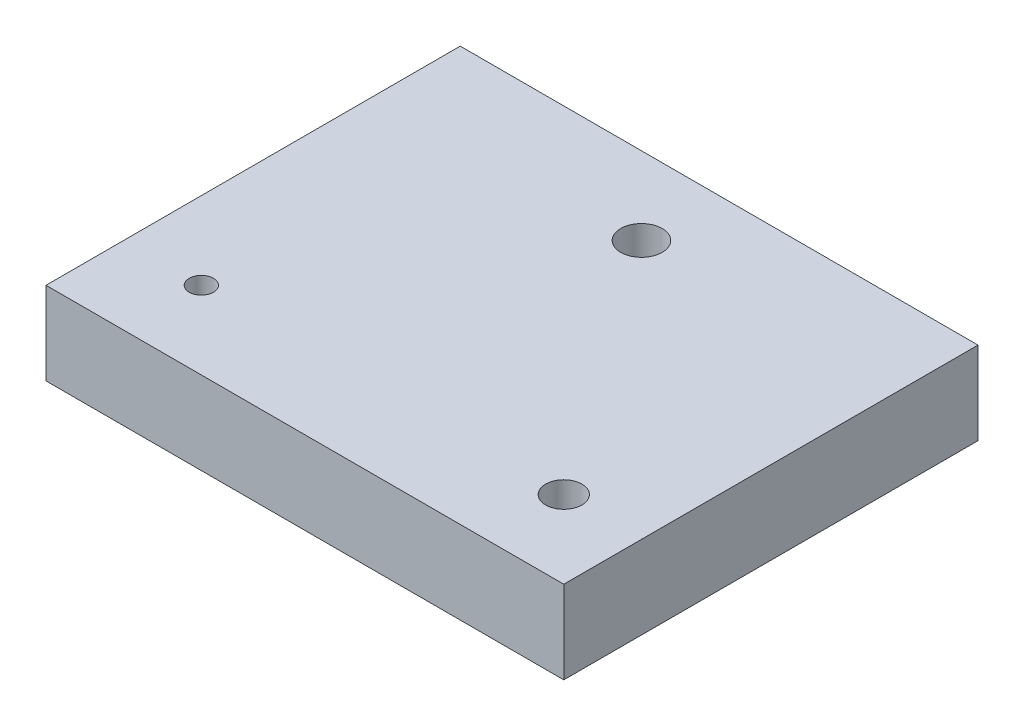
ISO-10303-21;
HEADER;
FILE_DESCRIPTION(('STEP AP214'),'2;1');
FILE_NAME('part.step','',(''),(''),'','','');
FILE_SCHEMA(('AUTOMOTIVE_DESIGN { 1 0 10303 214 1 1 1 1 }'));
ENDSEC;
DATA;
#1=APPLICATION_CONTEXT('core data for automotive mechanical design processes');
#2=APPLICATION_PROTOCOL_DEFINITION('international standard','automotive_design',2000,#1);
#3=PRODUCT_CONTEXT('',#1,'mechanical');
#4=PRODUCT('Part','Part','',(#3));
#5=PRODUCT_RELATED_PRODUCT_CATEGORY('part','',(#4));
#6=PRODUCT_DEFINITION_FORMATION('','',#4);
#7=PRODUCT_DEFINITION_CONTEXT('part definition',#1,'design');
#8=PRODUCT_DEFINITION('design','',#6,#7);
#9=PRODUCT_DEFINITION_SHAPE('','',#8);
#10=(LENGTH_UNIT() NAMED_UNIT(*) SI_UNIT(.MILLI.,.METRE.));
#11=(NAMED_UNIT(*) PLANE_ANGLE_UNIT() SI_UNIT($,.RADIAN.));
#12=(NAMED_UNIT(*) SI_UNIT($,.STERADIAN.) SOLID_ANGLE_UNIT());
#13=UNCERTAINTY_MEASURE_WITH_UNIT(LENGTH_MEASURE(1.E-05),#10,'distance_accuracy_value','');
#14=(GEOMETRIC_REPRESENTATION_CONTEXT(3) GLOBAL_UNCERTAINTY_ASSIGNED_CONTEXT((#13)) GLOBAL_UNIT_ASSIGNED_CONTEXT((#10,
#11,#12)) REPRESENTATION_CONTEXT('',''));
#15=CARTESIAN_POINT('',(0.,0.,0.));
#16=DIRECTION('',(0.,0.,1.));
#17=DIRECTION('',(1.,0.,0.));
#18=AXIS2_PLACEMENT_3D('',#15,#16,#17);
#19=CARTESIAN_POINT('',(0.,16.,0.));
#20=DIRECTION('',(0.,-1.,0.));
#21=DIRECTION('',(0.,0.,-1.));
#22=AXIS2_PLACEMENT_3D('',#19,#20,#21);
#23=PLANE('',#22);
#24=DIRECTION('',(0.,0.,-1.));
#25=VECTOR('',#24,1.);
#26=CARTESIAN_POINT('',(50.,16.,40.));
#27=LINE('',#26,#25);
#28=CARTESIAN_POINT('',(50.,16.,40.));
#29=VERTEX_POINT('',#28);
#30=CARTESIAN_POINT('',(50.,16.,-40.));
#31=VERTEX_POINT('',#30);
#32=EDGE_CURVE('E89',#29,#31,#27,.T.);
#33=ORIENTED_EDGE('',*,*,#32,.T.);
#34=DIRECTION('',(-1.,0.,0.));
#35=VECTOR('',#34,1.);
#36=CARTESIAN_POINT('',(-50.,16.,-40.));
#37=LINE('',#36,#35);
#38=CARTESIAN_POINT('',(-50.,16.,-40.));
#39=VERTEX_POINT('',#38);
#40=EDGE_CURVE('E84',#31,#39,#37,.T.);
#41=ORIENTED_EDGE('',*,*,#40,.T.);
#42=DIRECTION('',(0.,0.,1.));
#43=VECTOR('',#42,1.);
#44=CARTESIAN_POINT('',(-50.,16.,40.));
#45=LINE('',#44,#43);
#46=CARTESIAN_POINT('',(-50.,16.,40.));
#47=VERTEX_POINT('',#46);
#48=EDGE_CURVE('E87',#39,#47,#45,.T.);
#49=ORIENTED_EDGE('',*,*,#48,.T.);
#50=DIRECTION('',(1.,0.,0.));
#51=VECTOR('',#50,1.);
#52=CARTESIAN_POINT('',(-50.,16.,40.));
#53=LINE('',#52,#51);
#54=EDGE_CURVE('E54',#47,#29,#53,.T.);
#55=ORIENTED_EDGE('',*,*,#54,.T.);
#56=EDGE_LOOP('',(#33,#41,#49,#55));
#57=FACE_BOUND('',#56,.T.);
#58=CARTESIAN_POINT('',(-35.,16.,25.));
#59=DIRECTION('',(0.,1.,0.));
#60=DIRECTION('',(0.,0.,1.));
#61=AXIS2_PLACEMENT_3D('',#58,#59,#60);
#62=CIRCLE('',#61,2.3426064283291);
#63=CARTESIAN_POINT('',(-35.,16.,27.3426064283291));
#64=VERTEX_POINT('',#63);
#65=EDGE_CURVE('E104',#64,#64,#62,.T.);
#66=ORIENTED_EDGE('',*,*,#65,.F.);
#67=EDGE_LOOP('',(#66));
#68=FACE_BOUND('',#67,.T.);
#69=CARTESIAN_POINT('',(35.,16.,25.));
#70=DIRECTION('',(0.,1.,0.));
#71=DIRECTION('',(0.,0.,1.));
#72=AXIS2_PLACEMENT_3D('',#69,#70,#71);
#73=CIRCLE('',#72,3.5);
#74=CARTESIAN_POINT('',(35.,16.,28.5));
#75=VERTEX_POINT('',#74);
#76=EDGE_CURVE('E119',#75,#75,#73,.T.);
#77=ORIENTED_EDGE('',*,*,#76,.F.);
#78=EDGE_LOOP('',(#77));
#79=FACE_BOUND('',#78,.T.);
#80=CARTESIAN_POINT('',(0.,16.,-25.));
#81=DIRECTION('',(0.,1.,0.));
#82=DIRECTION('',(0.,0.,1.));
#83=AXIS2_PLACEMENT_3D('',#80,#81,#82);
#84=CIRCLE('',#83,4.);
#85=CARTESIAN_POINT('',(0.,16.,-21.));
#86=VERTEX_POINT('',#85);
#87=EDGE_CURVE('E125',#86,#86,#84,.T.);
#88=ORIENTED_EDGE('',*,*,#87,.F.);
#89=EDGE_LOOP('',(#88));
#90=FACE_BOUND('',#89,.T.);
#91=ADVANCED_FACE('F37',(#57,#68,#79,#90),#23,.F.);
#92=CARTESIAN_POINT('',(0.,0.,0.));
#93=DIRECTION('',(0.,-1.,0.));
#94=DIRECTION('',(0.,0.,-1.));
#95=AXIS2_PLACEMENT_3D('',#92,#93,#94);
#96=PLANE('',#95);
#97=CARTESIAN_POINT('',(35.,0.,25.));
#98=DIRECTION('',(0.,1.,0.));
#99=DIRECTION('',(0.,0.,1.));
#100=AXIS2_PLACEMENT_3D('',#97,#98,#99);
#101=CIRCLE('',#100,3.5);
#102=CARTESIAN_POINT('',(35.,0.,28.5));
#103=VERTEX_POINT('',#102);
#104=EDGE_CURVE('E122',#103,#103,#101,.T.);
#105=ORIENTED_EDGE('',*,*,#104,.T.);
#106=EDGE_LOOP('',(#105));
#107=FACE_BOUND('',#106,.T.);
#108=DIRECTION('',(0.,0.,-1.));
#109=VECTOR('',#108,1.);
#110=CARTESIAN_POINT('',(50.,0.,40.));
#111=LINE('',#110,#109);
#112=CARTESIAN_POINT('',(50.,0.,40.));
#113=VERTEX_POINT('',#112);
#114=CARTESIAN_POINT('',(50.,0.,-40.));
#115=VERTEX_POINT('',#114);
#116=EDGE_CURVE('E101',#113,#115,#111,.T.);
#117=ORIENTED_EDGE('',*,*,#116,.F.);
#118=DIRECTION('',(1.,0.,0.));
#119=VECTOR('',#118,1.);
#120=CARTESIAN_POINT('',(-50.,0.,40.));
#121=LINE('',#120,#119);
#122=CARTESIAN_POINT('',(-50.,0.,40.));
#123=VERTEX_POINT('',#122);
#124=EDGE_CURVE('E77',#123,#113,#121,.T.);
#125=ORIENTED_EDGE('',*,*,#124,.F.);
#126=DIRECTION('',(0.,0.,1.));
#127=VECTOR('',#126,1.);
#128=CARTESIAN_POINT('',(-50.,0.,40.));
#129=LINE('',#128,#127);
#130=CARTESIAN_POINT('',(-50.,0.,-40.));
#131=VERTEX_POINT('',#130);
#132=EDGE_CURVE('E71',#131,#123,#129,.T.);
#133=ORIENTED_EDGE('',*,*,#132,.F.);
#134=DIRECTION('',(-1.,0.,0.));
#135=VECTOR('',#134,1.);
#136=CARTESIAN_POINT('',(-50.,0.,-40.));
#137=LINE('',#136,#135);
#138=EDGE_CURVE('E93',#115,#131,#137,.T.);
#139=ORIENTED_EDGE('',*,*,#138,.F.);
#140=EDGE_LOOP('',(#117,#125,#133,#139));
#141=FACE_BOUND('',#140,.T.);
#142=CARTESIAN_POINT('',(-35.,0.,25.));
#143=DIRECTION('',(0.,1.,0.));
#144=DIRECTION('',(0.,0.,1.));
#145=AXIS2_PLACEMENT_3D('',#142,#143,#144);
#146=CIRCLE('',#145,2.3426064283291);
#147=CARTESIAN_POINT('',(-35.,0.,27.3426064283291));
#148=VERTEX_POINT('',#147);
#149=EDGE_CURVE('E116',#148,#148,#146,.T.);
#150=ORIENTED_EDGE('',*,*,#149,.T.);
#151=EDGE_LOOP('',(#150));
#152=FACE_BOUND('',#151,.T.);
#153=CARTESIAN_POINT('',(0.,0.,-25.));
#154=DIRECTION('',(0.,1.,0.));
#155=DIRECTION('',(0.,0.,1.));
#156=AXIS2_PLACEMENT_3D('',#153,#154,#155);
#157=CIRCLE('',#156,4.);
#158=CARTESIAN_POINT('',(0.,0.,-21.));
#159=VERTEX_POINT('',#158);
#160=EDGE_CURVE('E128',#159,#159,#157,.T.);
#161=ORIENTED_EDGE('',*,*,#160,.T.);
#162=EDGE_LOOP('',(#161));
#163=FACE_BOUND('',#162,.T.);
#164=ADVANCED_FACE('F112',(#107,#141,#152,#163),#96,.T.);
#165=CARTESIAN_POINT('',(50.,16.,40.));
#166=DIRECTION('',(-1.,0.,0.));
#167=DIRECTION('',(0.,0.,1.));
#168=AXIS2_PLACEMENT_3D('',#165,#166,#167);
#169=PLANE('',#168);
#170=ORIENTED_EDGE('',*,*,#116,.T.);
#171=DIRECTION('',(0.,-1.,0.));
#172=VECTOR('',#171,1.);
#173=CARTESIAN_POINT('',(50.,16.,-40.));
#174=LINE('',#173,#172);
#175=EDGE_CURVE('E11',#31,#115,#174,.T.);
#176=ORIENTED_EDGE('',*,*,#175,.F.);
#177=ORIENTED_EDGE('',*,*,#32,.F.);
#178=DIRECTION('',(0.,-1.,0.));
#179=VECTOR('',#178,1.);
#180=CARTESIAN_POINT('',(50.,16.,40.));
#181=LINE('',#180,#179);
#182=EDGE_CURVE('E97',#29,#113,#181,.T.);
#183=ORIENTED_EDGE('',*,*,#182,.T.);
#184=EDGE_LOOP('',(#170,#176,#177,#183));
#185=FACE_BOUND('',#184,.T.);
#186=ADVANCED_FACE('F39',(#185),#169,.F.);
#187=CARTESIAN_POINT('',(-50.,16.,-40.));
#188=DIRECTION('',(0.,0.,1.));
#189=DIRECTION('',(1.,0.,0.));
#190=AXIS2_PLACEMENT_3D('',#187,#188,#189);
#191=PLANE('',#190);
#192=ORIENTED_EDGE('',*,*,#138,.T.);
#193=DIRECTION('',(0.,-1.,0.));
#194=VECTOR('',#193,1.);
#195=CARTESIAN_POINT('',(-50.,16.,-40.));
#196=LINE('',#195,#194);
#197=EDGE_CURVE('E46',#39,#131,#196,.T.);
#198=ORIENTED_EDGE('',*,*,#197,.F.);
#199=ORIENTED_EDGE('',*,*,#40,.F.);
#200=ORIENTED_EDGE('',*,*,#175,.T.);
#201=EDGE_LOOP('',(#192,#198,#199,#200));
#202=FACE_BOUND('',#201,.T.);
#203=ADVANCED_FACE('F92',(#202),#191,.F.);
#204=CARTESIAN_POINT('',(-50.,16.,40.));
#205=DIRECTION('',(1.,0.,0.));
#206=DIRECTION('',(0.,0.,-1.));
#207=AXIS2_PLACEMENT_3D('',#204,#205,#206);
#208=PLANE('',#207);
#209=ORIENTED_EDGE('',*,*,#132,.T.);
#210=DIRECTION('',(0.,-1.,0.));
#211=VECTOR('',#210,1.);
#212=CARTESIAN_POINT('',(-50.,16.,40.));
#213=LINE('',#212,#211);
#214=EDGE_CURVE('E94',#47,#123,#213,.T.);
#215=ORIENTED_EDGE('',*,*,#214,.F.);
#216=ORIENTED_EDGE('',*,*,#48,.F.);
#217=ORIENTED_EDGE('',*,*,#197,.T.);
#218=EDGE_LOOP('',(#209,#215,#216,#217));
#219=FACE_BOUND('',#218,.T.);
#220=ADVANCED_FACE('F95',(#219),#208,.F.);
#221=CARTESIAN_POINT('',(-50.,16.,40.));
#222=DIRECTION('',(0.,0.,-1.));
#223=DIRECTION('',(-1.,0.,0.));
#224=AXIS2_PLACEMENT_3D('',#221,#222,#223);
#225=PLANE('',#224);
#226=ORIENTED_EDGE('',*,*,#124,.T.);
#227=ORIENTED_EDGE('',*,*,#182,.F.);
#228=ORIENTED_EDGE('',*,*,#54,.F.);
#229=ORIENTED_EDGE('',*,*,#214,.T.);
#230=EDGE_LOOP('',(#226,#227,#228,#229));
#231=FACE_BOUND('',#230,.T.);
#232=ADVANCED_FACE('F109',(#231),#225,.F.);
#233=CARTESIAN_POINT('',(-35.,16.,25.));
#234=DIRECTION('',(0.,-1.,0.));
#235=DIRECTION('',(0.,0.,-1.));
#236=AXIS2_PLACEMENT_3D('',#233,#234,#235);
#237=CYLINDRICAL_SURFACE('',#236,2.3426064283291);
#238=ORIENTED_EDGE('',*,*,#65,.T.);
#239=EDGE_LOOP('',(#238));
#240=FACE_BOUND('',#239,.T.);
#241=ORIENTED_EDGE('',*,*,#149,.F.);
#242=EDGE_LOOP('',(#241));
#243=FACE_BOUND('',#242,.T.);
#244=ADVANCED_FACE('F145',(#240,#243),#237,.F.);
#245=CARTESIAN_POINT('',(35.,16.,25.));
#246=DIRECTION('',(0.,-1.,0.));
#247=DIRECTION('',(0.,0.,-1.));
#248=AXIS2_PLACEMENT_3D('',#245,#246,#247);
#249=CYLINDRICAL_SURFACE('',#248,3.5);
#250=ORIENTED_EDGE('',*,*,#76,.T.);
#251=EDGE_LOOP('',(#250));
#252=FACE_BOUND('',#251,.T.);
#253=ORIENTED_EDGE('',*,*,#104,.F.);
#254=EDGE_LOOP('',(#253));
#255=FACE_BOUND('',#254,.T.);
#256=ADVANCED_FACE('F199',(#252,#255),#249,.F.);
#257=CARTESIAN_POINT('',(0.,16.,-25.));
#258=DIRECTION('',(0.,-1.,0.));
#259=DIRECTION('',(0.,0.,-1.));
#260=AXIS2_PLACEMENT_3D('',#257,#258,#259);
#261=CYLINDRICAL_SURFACE('',#260,4.);
#262=ORIENTED_EDGE('',*,*,#87,.T.);
#263=EDGE_LOOP('',(#262));
#264=FACE_BOUND('',#263,.T.);
#265=ORIENTED_EDGE('',*,*,#160,.F.);
#266=EDGE_LOOP('',(#265));
#267=FACE_BOUND('',#266,.T.);
#268=ADVANCED_FACE('F134',(#264,#267),#261,.F.);
#269=CLOSED_SHELL('',(#91,#164,#186,#203,#220,#232,#244,#256,#268));
#270=MANIFOLD_SOLID_BREP('B2',#269);
#271=ADVANCED_BREP_SHAPE_REPRESENTATION('',(#18,#270),#14);
#272=SHAPE_DEFINITION_REPRESENTATION(#9,#271);
ENDSEC;
END-ISO-10303-21;
